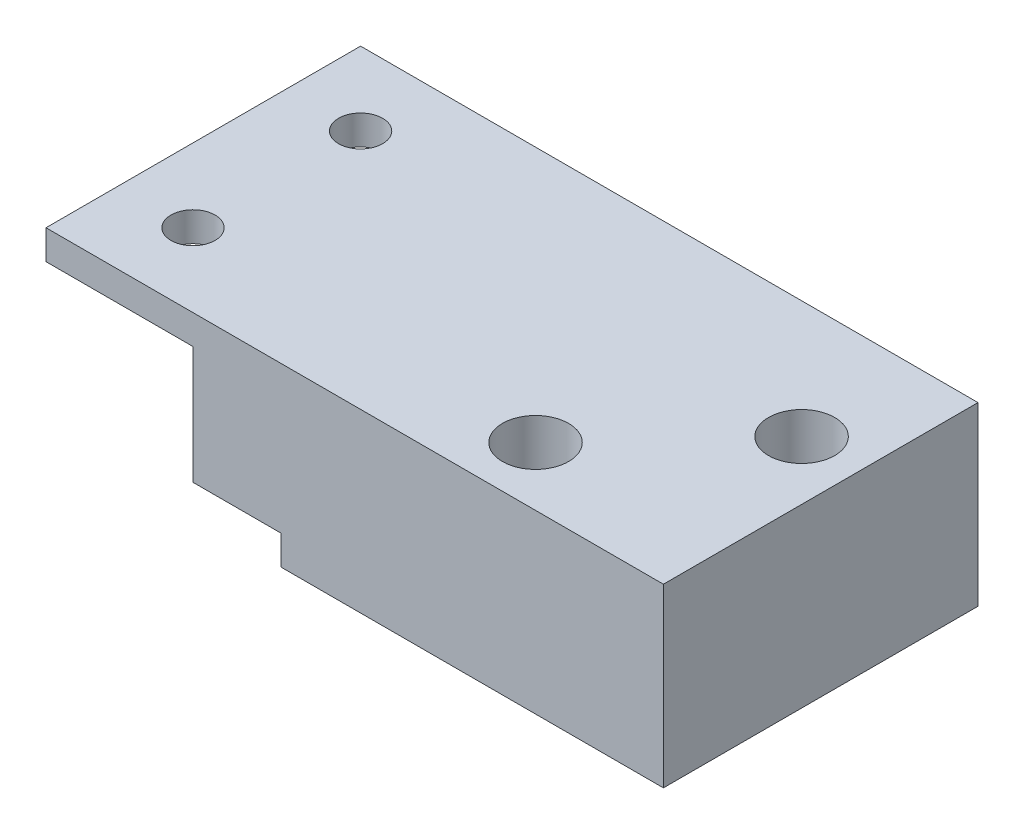
ISO-10303-21;
HEADER;
FILE_DESCRIPTION(('STEP AP214'),'2;1');
FILE_NAME('part.step','',(''),(''),'','','');
FILE_SCHEMA(('AUTOMOTIVE_DESIGN { 1 0 10303 214 1 1 1 1 }'));
ENDSEC;
DATA;
#1=APPLICATION_CONTEXT('core data for automotive mechanical design processes');
#2=APPLICATION_PROTOCOL_DEFINITION('international standard','automotive_design',2000,#1);
#3=PRODUCT_CONTEXT('',#1,'mechanical');
#4=PRODUCT('Part','Part','',(#3));
#5=PRODUCT_RELATED_PRODUCT_CATEGORY('part','',(#4));
#6=PRODUCT_DEFINITION_FORMATION('','',#4);
#7=PRODUCT_DEFINITION_CONTEXT('part definition',#1,'design');
#8=PRODUCT_DEFINITION('design','',#6,#7);
#9=PRODUCT_DEFINITION_SHAPE('','',#8);
#10=(LENGTH_UNIT() NAMED_UNIT(*) SI_UNIT(.MILLI.,.METRE.));
#11=(NAMED_UNIT(*) PLANE_ANGLE_UNIT() SI_UNIT($,.RADIAN.));
#12=(NAMED_UNIT(*) SI_UNIT($,.STERADIAN.) SOLID_ANGLE_UNIT());
#13=UNCERTAINTY_MEASURE_WITH_UNIT(LENGTH_MEASURE(1.E-05),#10,'distance_accuracy_value','');
#14=(GEOMETRIC_REPRESENTATION_CONTEXT(3) GLOBAL_UNCERTAINTY_ASSIGNED_CONTEXT((#13)) GLOBAL_UNIT_ASSIGNED_CONTEXT((#10,
#11,#12)) REPRESENTATION_CONTEXT('',''));
#15=CARTESIAN_POINT('',(0.,0.,0.));
#16=DIRECTION('',(0.,0.,1.));
#17=DIRECTION('',(1.,0.,0.));
#18=AXIS2_PLACEMENT_3D('',#15,#16,#17);
#19=CARTESIAN_POINT('',(0.,12.,21.4));
#20=DIRECTION('',(0.,0.,-1.));
#21=DIRECTION('',(-1.,0.,0.));
#22=AXIS2_PLACEMENT_3D('',#19,#20,#21);
#23=PLANE('',#22);
#24=DIRECTION('',(0.,1.,0.));
#25=VECTOR('',#24,1.);
#26=CARTESIAN_POINT('',(16.,0.,21.4));
#27=LINE('',#26,#25);
#28=CARTESIAN_POINT('',(16.,0.,21.4));
#29=VERTEX_POINT('',#28);
#30=CARTESIAN_POINT('',(16.,2.,21.4));
#31=VERTEX_POINT('',#30);
#32=EDGE_CURVE('E118',#29,#31,#27,.T.);
#33=ORIENTED_EDGE('',*,*,#32,.F.);
#34=DIRECTION('',(1.,0.,0.));
#35=VECTOR('',#34,1.);
#36=CARTESIAN_POINT('',(0.,0.,21.4));
#37=LINE('',#36,#35);
#38=CARTESIAN_POINT('',(42.,0.,21.4));
#39=VERTEX_POINT('',#38);
#40=EDGE_CURVE('E121',#29,#39,#37,.T.);
#41=ORIENTED_EDGE('',*,*,#40,.T.);
#42=DIRECTION('',(0.,-1.,0.));
#43=VECTOR('',#42,1.);
#44=CARTESIAN_POINT('',(42.,12.,21.4));
#45=LINE('',#44,#43);
#46=CARTESIAN_POINT('',(42.,12.,21.4));
#47=VERTEX_POINT('',#46);
#48=EDGE_CURVE('E12',#47,#39,#45,.T.);
#49=ORIENTED_EDGE('',*,*,#48,.F.);
#50=DIRECTION('',(1.,0.,0.));
#51=VECTOR('',#50,1.);
#52=CARTESIAN_POINT('',(0.,12.,21.4));
#53=LINE('',#52,#51);
#54=CARTESIAN_POINT('',(0.,12.,21.4));
#55=VERTEX_POINT('',#54);
#56=EDGE_CURVE('E142',#55,#47,#53,.T.);
#57=ORIENTED_EDGE('',*,*,#56,.F.);
#58=DIRECTION('',(0.,-1.,0.));
#59=VECTOR('',#58,1.);
#60=CARTESIAN_POINT('',(0.,12.,21.4));
#61=LINE('',#60,#59);
#62=CARTESIAN_POINT('',(0.,10.,21.4));
#63=VERTEX_POINT('',#62);
#64=EDGE_CURVE('E66',#55,#63,#61,.T.);
#65=ORIENTED_EDGE('',*,*,#64,.T.);
#66=DIRECTION('',(1.,0.,0.));
#67=VECTOR('',#66,1.);
#68=CARTESIAN_POINT('',(0.,10.,21.4));
#69=LINE('',#68,#67);
#70=CARTESIAN_POINT('',(10.,10.,21.4));
#71=VERTEX_POINT('',#70);
#72=EDGE_CURVE('E191',#63,#71,#69,.T.);
#73=ORIENTED_EDGE('',*,*,#72,.T.);
#74=DIRECTION('',(0.,1.,0.));
#75=VECTOR('',#74,1.);
#76=CARTESIAN_POINT('',(10.,0.,21.4));
#77=LINE('',#76,#75);
#78=CARTESIAN_POINT('',(10.,2.,21.4));
#79=VERTEX_POINT('',#78);
#80=EDGE_CURVE('E189',#79,#71,#77,.T.);
#81=ORIENTED_EDGE('',*,*,#80,.F.);
#82=DIRECTION('',(1.,0.,0.));
#83=VECTOR('',#82,1.);
#84=CARTESIAN_POINT('',(10.,2.,21.4));
#85=LINE('',#84,#83);
#86=EDGE_CURVE('E129',#79,#31,#85,.T.);
#87=ORIENTED_EDGE('',*,*,#86,.T.);
#88=EDGE_LOOP('',(#33,#41,#49,#57,#65,#73,#81,#87));
#89=FACE_BOUND('',#88,.T.);
#90=ADVANCED_FACE('F41',(#89),#23,.F.);
#91=CARTESIAN_POINT('',(0.,12.,0.));
#92=DIRECTION('',(0.,0.,-1.));
#93=DIRECTION('',(-1.,0.,0.));
#94=AXIS2_PLACEMENT_3D('',#91,#92,#93);
#95=PLANE('',#94);
#96=DIRECTION('',(1.,0.,0.));
#97=VECTOR('',#96,1.);
#98=CARTESIAN_POINT('',(0.,0.,0.));
#99=LINE('',#98,#97);
#100=CARTESIAN_POINT('',(16.,0.,0.));
#101=VERTEX_POINT('',#100);
#102=CARTESIAN_POINT('',(42.,0.,0.));
#103=VERTEX_POINT('',#102);
#104=EDGE_CURVE('E82',#101,#103,#99,.T.);
#105=ORIENTED_EDGE('',*,*,#104,.F.);
#106=DIRECTION('',(0.,1.,0.));
#107=VECTOR('',#106,1.);
#108=CARTESIAN_POINT('',(16.,0.,0.));
#109=LINE('',#108,#107);
#110=CARTESIAN_POINT('',(16.,2.,0.));
#111=VERTEX_POINT('',#110);
#112=EDGE_CURVE('E57',#101,#111,#109,.T.);
#113=ORIENTED_EDGE('',*,*,#112,.T.);
#114=DIRECTION('',(1.,0.,0.));
#115=VECTOR('',#114,1.);
#116=CARTESIAN_POINT('',(10.,2.,0.));
#117=LINE('',#116,#115);
#118=CARTESIAN_POINT('',(10.,2.,0.));
#119=VERTEX_POINT('',#118);
#120=EDGE_CURVE('E130',#119,#111,#117,.T.);
#121=ORIENTED_EDGE('',*,*,#120,.F.);
#122=DIRECTION('',(0.,1.,0.));
#123=VECTOR('',#122,1.);
#124=CARTESIAN_POINT('',(10.,0.,0.));
#125=LINE('',#124,#123);
#126=CARTESIAN_POINT('',(10.,10.,0.));
#127=VERTEX_POINT('',#126);
#128=EDGE_CURVE('E177',#119,#127,#125,.T.);
#129=ORIENTED_EDGE('',*,*,#128,.T.);
#130=DIRECTION('',(1.,0.,0.));
#131=VECTOR('',#130,1.);
#132=CARTESIAN_POINT('',(0.,10.,0.));
#133=LINE('',#132,#131);
#134=CARTESIAN_POINT('',(0.,10.,0.));
#135=VERTEX_POINT('',#134);
#136=EDGE_CURVE('E192',#135,#127,#133,.T.);
#137=ORIENTED_EDGE('',*,*,#136,.F.);
#138=DIRECTION('',(0.,-1.,0.));
#139=VECTOR('',#138,1.);
#140=CARTESIAN_POINT('',(0.,12.,0.));
#141=LINE('',#140,#139);
#142=CARTESIAN_POINT('',(0.,12.,0.));
#143=VERTEX_POINT('',#142);
#144=EDGE_CURVE('E144',#143,#135,#141,.T.);
#145=ORIENTED_EDGE('',*,*,#144,.F.);
#146=DIRECTION('',(1.,0.,0.));
#147=VECTOR('',#146,1.);
#148=CARTESIAN_POINT('',(0.,12.,0.));
#149=LINE('',#148,#147);
#150=CARTESIAN_POINT('',(42.,12.,0.));
#151=VERTEX_POINT('',#150);
#152=EDGE_CURVE('E203',#143,#151,#149,.T.);
#153=ORIENTED_EDGE('',*,*,#152,.T.);
#154=DIRECTION('',(0.,-1.,0.));
#155=VECTOR('',#154,1.);
#156=CARTESIAN_POINT('',(42.,12.,0.));
#157=LINE('',#156,#155);
#158=EDGE_CURVE('E49',#151,#103,#157,.T.);
#159=ORIENTED_EDGE('',*,*,#158,.T.);
#160=EDGE_LOOP('',(#105,#113,#121,#129,#137,#145,#153,#159));
#161=FACE_BOUND('',#160,.T.);
#162=ADVANCED_FACE('F212',(#161),#95,.T.);
#163=CARTESIAN_POINT('',(0.,0.,0.));
#164=DIRECTION('',(0.,1.,0.));
#165=DIRECTION('',(0.,0.,1.));
#166=AXIS2_PLACEMENT_3D('',#163,#164,#165);
#167=PLANE('',#166);
#168=CARTESIAN_POINT('',(38.,0.,8.00000000000001));
#169=DIRECTION('',(0.,1.,0.));
#170=DIRECTION('',(0.,0.,1.));
#171=AXIS2_PLACEMENT_3D('',#168,#169,#170);
#172=CIRCLE('',#171,1.5);
#173=CARTESIAN_POINT('',(38.,0.,9.50000000000002));
#174=VERTEX_POINT('',#173);
#175=EDGE_CURVE('E420',#174,#174,#172,.T.);
#176=ORIENTED_EDGE('',*,*,#175,.T.);
#177=EDGE_LOOP('',(#176));
#178=FACE_BOUND('',#177,.T.);
#179=CARTESIAN_POINT('',(29.3,0.,17.4));
#180=DIRECTION('',(0.,1.,0.));
#181=DIRECTION('',(0.,0.,1.));
#182=AXIS2_PLACEMENT_3D('',#179,#180,#181);
#183=CIRCLE('',#182,1.5);
#184=CARTESIAN_POINT('',(29.3,0.,18.9));
#185=VERTEX_POINT('',#184);
#186=EDGE_CURVE('E416',#185,#185,#183,.T.);
#187=ORIENTED_EDGE('',*,*,#186,.T.);
#188=EDGE_LOOP('',(#187));
#189=FACE_BOUND('',#188,.T.);
#190=CARTESIAN_POINT('',(20.3,0.,14.));
#191=DIRECTION('',(0.,-1.,0.));
#192=DIRECTION('',(0.,0.,-1.));
#193=AXIS2_PLACEMENT_3D('',#190,#191,#192);
#194=CIRCLE('',#193,3.1);
#195=CARTESIAN_POINT('',(20.3,0.,10.9));
#196=VERTEX_POINT('',#195);
#197=EDGE_CURVE('E178',#196,#196,#194,.T.);
#198=ORIENTED_EDGE('',*,*,#197,.F.);
#199=EDGE_LOOP('',(#198));
#200=FACE_BOUND('',#199,.T.);
#201=DIRECTION('',(0.,0.,-1.));
#202=VECTOR('',#201,1.);
#203=CARTESIAN_POINT('',(16.,0.,21.4));
#204=LINE('',#203,#202);
#205=EDGE_CURVE('E115',#29,#101,#204,.T.);
#206=ORIENTED_EDGE('',*,*,#205,.T.);
#207=ORIENTED_EDGE('',*,*,#104,.T.);
#208=DIRECTION('',(0.,0.,-1.));
#209=VECTOR('',#208,1.);
#210=CARTESIAN_POINT('',(42.,0.,0.));
#211=LINE('',#210,#209);
#212=EDGE_CURVE('E134',#39,#103,#211,.T.);
#213=ORIENTED_EDGE('',*,*,#212,.F.);
#214=ORIENTED_EDGE('',*,*,#40,.F.);
#215=EDGE_LOOP('',(#206,#207,#213,#214));
#216=FACE_BOUND('',#215,.T.);
#217=ADVANCED_FACE('F132',(#178,#189,#200,#216),#167,.F.);
#218=CARTESIAN_POINT('',(42.,12.,0.));
#219=DIRECTION('',(-1.,0.,0.));
#220=DIRECTION('',(0.,0.,1.));
#221=AXIS2_PLACEMENT_3D('',#218,#219,#220);
#222=PLANE('',#221);
#223=ORIENTED_EDGE('',*,*,#212,.T.);
#224=ORIENTED_EDGE('',*,*,#158,.F.);
#225=DIRECTION('',(0.,0.,-1.));
#226=VECTOR('',#225,1.);
#227=CARTESIAN_POINT('',(42.,12.,0.));
#228=LINE('',#227,#226);
#229=EDGE_CURVE('E89',#47,#151,#228,.T.);
#230=ORIENTED_EDGE('',*,*,#229,.F.);
#231=ORIENTED_EDGE('',*,*,#48,.T.);
#232=EDGE_LOOP('',(#223,#224,#230,#231));
#233=FACE_BOUND('',#232,.T.);
#234=ADVANCED_FACE('F211',(#233),#222,.F.);
#235=CARTESIAN_POINT('',(0.,12.,0.));
#236=DIRECTION('',(-1.,0.,0.));
#237=DIRECTION('',(0.,0.,1.));
#238=AXIS2_PLACEMENT_3D('',#235,#236,#237);
#239=PLANE('',#238);
#240=DIRECTION('',(0.,0.,-1.));
#241=VECTOR('',#240,1.);
#242=CARTESIAN_POINT('',(0.,10.,21.4));
#243=LINE('',#242,#241);
#244=EDGE_CURVE('E195',#63,#135,#243,.T.);
#245=ORIENTED_EDGE('',*,*,#244,.F.);
#246=ORIENTED_EDGE('',*,*,#64,.F.);
#247=DIRECTION('',(0.,0.,-1.));
#248=VECTOR('',#247,1.);
#249=CARTESIAN_POINT('',(0.,12.,0.));
#250=LINE('',#249,#248);
#251=EDGE_CURVE('E138',#55,#143,#250,.T.);
#252=ORIENTED_EDGE('',*,*,#251,.T.);
#253=ORIENTED_EDGE('',*,*,#144,.T.);
#254=EDGE_LOOP('',(#245,#246,#252,#253));
#255=FACE_BOUND('',#254,.T.);
#256=ADVANCED_FACE('F208',(#255),#239,.T.);
#257=CARTESIAN_POINT('',(0.,12.,0.));
#258=DIRECTION('',(0.,1.,0.));
#259=DIRECTION('',(0.,0.,1.));
#260=AXIS2_PLACEMENT_3D('',#257,#258,#259);
#261=PLANE('',#260);
#262=CARTESIAN_POINT('',(4.99999999999999,12.,16.4));
#263=DIRECTION('',(0.,1.,0.));
#264=DIRECTION('',(0.,0.,1.));
#265=AXIS2_PLACEMENT_3D('',#262,#263,#264);
#266=CIRCLE('',#265,1.5);
#267=CARTESIAN_POINT('',(4.99999999999999,12.,17.9));
#268=VERTEX_POINT('',#267);
#269=EDGE_CURVE('E261',#268,#268,#266,.T.);
#270=ORIENTED_EDGE('',*,*,#269,.F.);
#271=EDGE_LOOP('',(#270));
#272=FACE_BOUND('',#271,.T.);
#273=CARTESIAN_POINT('',(4.99999999999999,12.,5.00000000000003));
#274=DIRECTION('',(0.,1.,0.));
#275=DIRECTION('',(0.,0.,1.));
#276=AXIS2_PLACEMENT_3D('',#273,#274,#275);
#277=CIRCLE('',#276,1.5);
#278=CARTESIAN_POINT('',(4.99999999999999,12.,6.50000000000003));
#279=VERTEX_POINT('',#278);
#280=EDGE_CURVE('E152',#279,#279,#277,.T.);
#281=ORIENTED_EDGE('',*,*,#280,.F.);
#282=EDGE_LOOP('',(#281));
#283=FACE_BOUND('',#282,.T.);
#284=CARTESIAN_POINT('',(38.,12.,8.00000000000001));
#285=DIRECTION('',(0.,1.,0.));
#286=DIRECTION('',(0.,0.,1.));
#287=AXIS2_PLACEMENT_3D('',#284,#285,#286);
#288=CIRCLE('',#287,2.25);
#289=CARTESIAN_POINT('',(38.,12.,10.25));
#290=VERTEX_POINT('',#289);
#291=EDGE_CURVE('E168',#290,#290,#288,.T.);
#292=ORIENTED_EDGE('',*,*,#291,.F.);
#293=EDGE_LOOP('',(#292));
#294=FACE_BOUND('',#293,.T.);
#295=CARTESIAN_POINT('',(29.3,12.,17.4));
#296=DIRECTION('',(0.,1.,0.));
#297=DIRECTION('',(0.,0.,1.));
#298=AXIS2_PLACEMENT_3D('',#295,#296,#297);
#299=CIRCLE('',#298,2.25000000000001);
#300=CARTESIAN_POINT('',(29.3,12.,19.65));
#301=VERTEX_POINT('',#300);
#302=EDGE_CURVE('E163',#301,#301,#299,.T.);
#303=ORIENTED_EDGE('',*,*,#302,.F.);
#304=EDGE_LOOP('',(#303));
#305=FACE_BOUND('',#304,.T.);
#306=ORIENTED_EDGE('',*,*,#56,.T.);
#307=ORIENTED_EDGE('',*,*,#229,.T.);
#308=ORIENTED_EDGE('',*,*,#152,.F.);
#309=ORIENTED_EDGE('',*,*,#251,.F.);
#310=EDGE_LOOP('',(#306,#307,#308,#309));
#311=FACE_BOUND('',#310,.T.);
#312=ADVANCED_FACE('F210',(#272,#283,#294,#305,#311),#261,.T.);
#313=CARTESIAN_POINT('',(16.,0.,21.4));
#314=DIRECTION('',(-1.,0.,0.));
#315=DIRECTION('',(0.,0.,1.));
#316=AXIS2_PLACEMENT_3D('',#313,#314,#315);
#317=PLANE('',#316);
#318=ORIENTED_EDGE('',*,*,#112,.F.);
#319=ORIENTED_EDGE('',*,*,#205,.F.);
#320=ORIENTED_EDGE('',*,*,#32,.T.);
#321=DIRECTION('',(0.,0.,-1.));
#322=VECTOR('',#321,1.);
#323=CARTESIAN_POINT('',(16.,2.,21.4));
#324=LINE('',#323,#322);
#325=EDGE_CURVE('E122',#31,#111,#324,.T.);
#326=ORIENTED_EDGE('',*,*,#325,.T.);
#327=EDGE_LOOP('',(#318,#319,#320,#326));
#328=FACE_BOUND('',#327,.T.);
#329=ADVANCED_FACE('F117',(#328),#317,.T.);
#330=CARTESIAN_POINT('',(10.,2.,21.4));
#331=DIRECTION('',(0.,1.,0.));
#332=DIRECTION('',(-1.,0.,0.));
#333=AXIS2_PLACEMENT_3D('',#330,#331,#332);
#334=PLANE('',#333);
#335=ORIENTED_EDGE('',*,*,#120,.T.);
#336=ORIENTED_EDGE('',*,*,#325,.F.);
#337=ORIENTED_EDGE('',*,*,#86,.F.);
#338=DIRECTION('',(0.,0.,-1.));
#339=VECTOR('',#338,1.);
#340=CARTESIAN_POINT('',(10.,2.,21.4));
#341=LINE('',#340,#339);
#342=EDGE_CURVE('E182',#79,#119,#341,.T.);
#343=ORIENTED_EDGE('',*,*,#342,.T.);
#344=EDGE_LOOP('',(#335,#336,#337,#343));
#345=FACE_BOUND('',#344,.T.);
#346=ADVANCED_FACE('F217',(#345),#334,.F.);
#347=CARTESIAN_POINT('',(0.,10.,21.4));
#348=DIRECTION('',(0.,1.,0.));
#349=DIRECTION('',(-1.,0.,0.));
#350=AXIS2_PLACEMENT_3D('',#347,#348,#349);
#351=PLANE('',#350);
#352=CARTESIAN_POINT('',(4.99999999999999,10.,16.4));
#353=DIRECTION('',(0.,1.,0.));
#354=DIRECTION('',(-1.,0.,0.));
#355=AXIS2_PLACEMENT_3D('',#352,#353,#354);
#356=CIRCLE('',#355,1.5);
#357=CARTESIAN_POINT('',(4.99999999999999,10.,17.9));
#358=VERTEX_POINT('',#357);
#359=EDGE_CURVE('E44',#358,#358,#356,.T.);
#360=ORIENTED_EDGE('',*,*,#359,.T.);
#361=EDGE_LOOP('',(#360));
#362=FACE_BOUND('',#361,.T.);
#363=CARTESIAN_POINT('',(4.99999999999999,10.,5.00000000000003));
#364=DIRECTION('',(0.,1.,0.));
#365=DIRECTION('',(-1.,0.,0.));
#366=AXIS2_PLACEMENT_3D('',#363,#364,#365);
#367=CIRCLE('',#366,1.5);
#368=CARTESIAN_POINT('',(4.99999999999999,10.,6.50000000000003));
#369=VERTEX_POINT('',#368);
#370=EDGE_CURVE('E154',#369,#369,#367,.T.);
#371=ORIENTED_EDGE('',*,*,#370,.T.);
#372=EDGE_LOOP('',(#371));
#373=FACE_BOUND('',#372,.T.);
#374=ORIENTED_EDGE('',*,*,#136,.T.);
#375=DIRECTION('',(0.,0.,-1.));
#376=VECTOR('',#375,1.);
#377=CARTESIAN_POINT('',(10.,10.,21.4));
#378=LINE('',#377,#376);
#379=EDGE_CURVE('E184',#71,#127,#378,.T.);
#380=ORIENTED_EDGE('',*,*,#379,.F.);
#381=ORIENTED_EDGE('',*,*,#72,.F.);
#382=ORIENTED_EDGE('',*,*,#244,.T.);
#383=EDGE_LOOP('',(#374,#380,#381,#382));
#384=FACE_BOUND('',#383,.T.);
#385=ADVANCED_FACE('F222',(#362,#373,#384),#351,.F.);
#386=CARTESIAN_POINT('',(10.,0.,21.4));
#387=DIRECTION('',(-1.,0.,0.));
#388=DIRECTION('',(0.,0.,1.));
#389=AXIS2_PLACEMENT_3D('',#386,#387,#388);
#390=PLANE('',#389);
#391=ORIENTED_EDGE('',*,*,#80,.T.);
#392=ORIENTED_EDGE('',*,*,#379,.T.);
#393=ORIENTED_EDGE('',*,*,#128,.F.);
#394=ORIENTED_EDGE('',*,*,#342,.F.);
#395=EDGE_LOOP('',(#391,#392,#393,#394));
#396=FACE_BOUND('',#395,.T.);
#397=ADVANCED_FACE('F219',(#396),#390,.T.);
#398=CARTESIAN_POINT('',(20.3,2.6,14.));
#399=DIRECTION('',(0.,-1.,0.));
#400=DIRECTION('',(0.,0.,-1.));
#401=AXIS2_PLACEMENT_3D('',#398,#399,#400);
#402=CYLINDRICAL_SURFACE('',#401,3.1);
#403=CARTESIAN_POINT('',(20.3,2.6,14.));
#404=DIRECTION('',(0.,-1.,0.));
#405=DIRECTION('',(0.,0.,-1.));
#406=AXIS2_PLACEMENT_3D('',#403,#404,#405);
#407=CIRCLE('',#406,3.1);
#408=CARTESIAN_POINT('',(20.3,2.6,10.9));
#409=VERTEX_POINT('',#408);
#410=EDGE_CURVE('E174',#409,#409,#407,.T.);
#411=ORIENTED_EDGE('',*,*,#410,.F.);
#412=EDGE_LOOP('',(#411));
#413=FACE_BOUND('',#412,.T.);
#414=ORIENTED_EDGE('',*,*,#197,.T.);
#415=EDGE_LOOP('',(#414));
#416=FACE_BOUND('',#415,.T.);
#417=ADVANCED_FACE('F230',(#413,#416),#402,.F.);
#418=CARTESIAN_POINT('',(20.3,2.6,14.));
#419=DIRECTION('',(0.,-1.,0.));
#420=DIRECTION('',(0.,0.,-1.));
#421=AXIS2_PLACEMENT_3D('',#418,#419,#420);
#422=PLANE('',#421);
#423=ORIENTED_EDGE('',*,*,#410,.T.);
#424=EDGE_LOOP('',(#423));
#425=FACE_BOUND('',#424,.T.);
#426=ADVANCED_FACE('F273',(#425),#422,.T.);
#427=CARTESIAN_POINT('',(29.3,-6.36396103067894,17.4));
#428=DIRECTION('',(0.,1.,0.));
#429=DIRECTION('',(0.,0.,1.));
#430=AXIS2_PLACEMENT_3D('',#427,#428,#429);
#431=CYLINDRICAL_SURFACE('',#430,2.25000000000001);
#432=CARTESIAN_POINT('',(29.3,2.,17.4));
#433=DIRECTION('',(0.,1.,0.));
#434=DIRECTION('',(0.,0.,1.));
#435=AXIS2_PLACEMENT_3D('',#432,#433,#434);
#436=CIRCLE('',#435,2.25000000000001);
#437=CARTESIAN_POINT('',(29.3,2.,19.65));
#438=VERTEX_POINT('',#437);
#439=EDGE_CURVE('E159',#438,#438,#436,.F.);
#440=ORIENTED_EDGE('',*,*,#439,.T.);
#441=EDGE_LOOP('',(#440));
#442=FACE_BOUND('',#441,.T.);
#443=ORIENTED_EDGE('',*,*,#302,.T.);
#444=EDGE_LOOP('',(#443));
#445=FACE_BOUND('',#444,.T.);
#446=ADVANCED_FACE('F270',(#442,#445),#431,.F.);
#447=CARTESIAN_POINT('',(0.,2.,0.));
#448=DIRECTION('',(0.,1.,0.));
#449=DIRECTION('',(0.,0.,1.));
#450=AXIS2_PLACEMENT_3D('',#447,#448,#449);
#451=PLANE('',#450);
#452=CARTESIAN_POINT('',(29.3,2.,17.4));
#453=DIRECTION('',(0.,1.,0.));
#454=DIRECTION('',(0.,0.,1.));
#455=AXIS2_PLACEMENT_3D('',#452,#453,#454);
#456=CIRCLE('',#455,1.5);
#457=CARTESIAN_POINT('',(29.3,2.,18.9));
#458=VERTEX_POINT('',#457);
#459=EDGE_CURVE('E151',#458,#458,#456,.T.);
#460=ORIENTED_EDGE('',*,*,#459,.F.);
#461=EDGE_LOOP('',(#460));
#462=FACE_BOUND('',#461,.T.);
#463=ORIENTED_EDGE('',*,*,#439,.F.);
#464=EDGE_LOOP('',(#463));
#465=FACE_BOUND('',#464,.T.);
#466=ADVANCED_FACE('F272',(#462,#465),#451,.T.);
#467=CARTESIAN_POINT('',(38.,-6.36396103067894,8.00000000000001));
#468=DIRECTION('',(0.,1.,0.));
#469=DIRECTION('',(0.,0.,1.));
#470=AXIS2_PLACEMENT_3D('',#467,#468,#469);
#471=CYLINDRICAL_SURFACE('',#470,2.25);
#472=CARTESIAN_POINT('',(38.,2.,8.00000000000001));
#473=DIRECTION('',(0.,1.,0.));
#474=DIRECTION('',(0.,0.,1.));
#475=AXIS2_PLACEMENT_3D('',#472,#473,#474);
#476=CIRCLE('',#475,2.25);
#477=CARTESIAN_POINT('',(38.,2.,10.25));
#478=VERTEX_POINT('',#477);
#479=EDGE_CURVE('E171',#478,#478,#476,.F.);
#480=ORIENTED_EDGE('',*,*,#479,.T.);
#481=EDGE_LOOP('',(#480));
#482=FACE_BOUND('',#481,.T.);
#483=ORIENTED_EDGE('',*,*,#291,.T.);
#484=EDGE_LOOP('',(#483));
#485=FACE_BOUND('',#484,.T.);
#486=ADVANCED_FACE('F279',(#482,#485),#471,.F.);
#487=CARTESIAN_POINT('',(0.,2.,0.));
#488=DIRECTION('',(0.,1.,0.));
#489=DIRECTION('',(0.,0.,1.));
#490=AXIS2_PLACEMENT_3D('',#487,#488,#489);
#491=PLANE('',#490);
#492=CARTESIAN_POINT('',(38.,2.,8.00000000000001));
#493=DIRECTION('',(0.,1.,0.));
#494=DIRECTION('',(0.,0.,1.));
#495=AXIS2_PLACEMENT_3D('',#492,#493,#494);
#496=CIRCLE('',#495,1.5);
#497=CARTESIAN_POINT('',(38.,2.,9.50000000000002));
#498=VERTEX_POINT('',#497);
#499=EDGE_CURVE('E148',#498,#498,#496,.T.);
#500=ORIENTED_EDGE('',*,*,#499,.F.);
#501=EDGE_LOOP('',(#500));
#502=FACE_BOUND('',#501,.T.);
#503=ORIENTED_EDGE('',*,*,#479,.F.);
#504=EDGE_LOOP('',(#503));
#505=FACE_BOUND('',#504,.T.);
#506=ADVANCED_FACE('F314',(#502,#505),#491,.T.);
#507=CARTESIAN_POINT('',(38.,0.,8.00000000000001));
#508=DIRECTION('',(0.,1.,0.));
#509=DIRECTION('',(0.,0.,1.));
#510=AXIS2_PLACEMENT_3D('',#507,#508,#509);
#511=CYLINDRICAL_SURFACE('',#510,1.5);
#512=CARTESIAN_POINT('',(38.,2.,9.50000000000002));
#513=CARTESIAN_POINT('',(38.,1.97916666666667,9.50000000000002));
#514=CARTESIAN_POINT('',(38.,1.95833333333333,9.50000000000002));
#515=CARTESIAN_POINT('',(38.,1.91666666666667,9.50000000000002));
#516=CARTESIAN_POINT('',(38.,1.89583333333333,9.50000000000002));
#517=CARTESIAN_POINT('',(38.,1.85416666666667,9.50000000000002));
#518=CARTESIAN_POINT('',(38.,1.83333333333333,9.50000000000002));
#519=CARTESIAN_POINT('',(38.,1.79166666666667,9.50000000000002));
#520=CARTESIAN_POINT('',(38.,1.77083333333333,9.50000000000002));
#521=CARTESIAN_POINT('',(38.,1.72916666666667,9.50000000000002));
#522=CARTESIAN_POINT('',(38.,1.70833333333333,9.50000000000002));
#523=CARTESIAN_POINT('',(38.,1.66666666666667,9.50000000000002));
#524=CARTESIAN_POINT('',(38.,1.64583333333333,9.50000000000002));
#525=CARTESIAN_POINT('',(38.,1.60416666666667,9.50000000000002));
#526=CARTESIAN_POINT('',(38.,1.58333333333333,9.50000000000002));
#527=CARTESIAN_POINT('',(38.,1.54166666666667,9.50000000000002));
#528=CARTESIAN_POINT('',(38.,1.52083333333333,9.50000000000002));
#529=CARTESIAN_POINT('',(38.,1.47916666666667,9.50000000000002));
#530=CARTESIAN_POINT('',(38.,1.45833333333333,9.50000000000002));
#531=CARTESIAN_POINT('',(38.,1.41666666666667,9.50000000000002));
#532=CARTESIAN_POINT('',(38.,1.39583333333333,9.50000000000002));
#533=CARTESIAN_POINT('',(38.,1.35416666666667,9.50000000000002));
#534=CARTESIAN_POINT('',(38.,1.33333333333333,9.50000000000002));
#535=CARTESIAN_POINT('',(38.,1.29166666666667,9.50000000000002));
#536=CARTESIAN_POINT('',(38.,1.27083333333333,9.50000000000002));
#537=CARTESIAN_POINT('',(38.,1.22916666666667,9.50000000000002));
#538=CARTESIAN_POINT('',(38.,1.20833333333333,9.50000000000002));
#539=CARTESIAN_POINT('',(38.,1.16666666666667,9.50000000000002));
#540=CARTESIAN_POINT('',(38.,1.14583333333333,9.50000000000002));
#541=CARTESIAN_POINT('',(38.,1.10416666666667,9.50000000000002));
#542=CARTESIAN_POINT('',(38.,1.08333333333333,9.50000000000002));
#543=CARTESIAN_POINT('',(38.,1.04166666666667,9.50000000000002));
#544=CARTESIAN_POINT('',(38.,1.02083333333333,9.50000000000002));
#545=CARTESIAN_POINT('',(38.,0.979166666666666,9.50000000000002));
#546=CARTESIAN_POINT('',(38.,0.958333333333332,9.50000000000002));
#547=CARTESIAN_POINT('',(38.,0.916666666666666,9.50000000000002));
#548=CARTESIAN_POINT('',(38.,0.895833333333332,9.50000000000002));
#549=CARTESIAN_POINT('',(38.,0.854166666666666,9.50000000000002));
#550=CARTESIAN_POINT('',(38.,0.833333333333332,9.50000000000002));
#551=CARTESIAN_POINT('',(38.,0.791666666666666,9.50000000000002));
#552=CARTESIAN_POINT('',(38.,0.770833333333332,9.50000000000002));
#553=CARTESIAN_POINT('',(38.,0.729166666666666,9.50000000000002));
#554=CARTESIAN_POINT('',(38.,0.708333333333332,9.50000000000002));
#555=CARTESIAN_POINT('',(38.,0.666666666666665,9.50000000000002));
#556=CARTESIAN_POINT('',(38.,0.645833333333332,9.50000000000002));
#557=CARTESIAN_POINT('',(38.,0.604166666666665,9.50000000000002));
#558=CARTESIAN_POINT('',(38.,0.583333333333332,9.50000000000002));
#559=CARTESIAN_POINT('',(38.,0.541666666666665,9.50000000000002));
#560=CARTESIAN_POINT('',(38.,0.520833333333332,9.50000000000002));
#561=CARTESIAN_POINT('',(38.,0.479166666666665,9.50000000000002));
#562=CARTESIAN_POINT('',(38.,0.458333333333332,9.50000000000002));
#563=CARTESIAN_POINT('',(38.,0.416666666666665,9.50000000000002));
#564=CARTESIAN_POINT('',(38.,0.395833333333332,9.50000000000002));
#565=CARTESIAN_POINT('',(38.,0.354166666666665,9.50000000000002));
#566=CARTESIAN_POINT('',(38.,0.333333333333332,9.50000000000002));
#567=CARTESIAN_POINT('',(38.,0.291666666666665,9.50000000000002));
#568=CARTESIAN_POINT('',(38.,0.270833333333332,9.50000000000002));
#569=CARTESIAN_POINT('',(38.,0.229166666666665,9.50000000000002));
#570=CARTESIAN_POINT('',(38.,0.208333333333332,9.50000000000002));
#571=CARTESIAN_POINT('',(38.,0.166666666666665,9.50000000000002));
#572=CARTESIAN_POINT('',(38.,0.145833333333332,9.50000000000002));
#573=CARTESIAN_POINT('',(38.,0.104166666666665,9.50000000000002));
#574=CARTESIAN_POINT('',(38.,0.0833333333333316,9.50000000000002));
#575=CARTESIAN_POINT('',(38.,0.041666666666665,9.50000000000002));
#576=CARTESIAN_POINT('',(38.,0.0208333333333316,9.50000000000002));
#577=CARTESIAN_POINT('',(38.,0.,9.50000000000002));
#578=B_SPLINE_CURVE_WITH_KNOTS('',3,(#512,#513,#514,#515,#516,#517,#518,#519,#520,#521,#522,
#523,#524,#525,#526,#527,#528,#529,#530,#531,#532,#533,#534,#535,#536,#537,#538,#539,#540,#541,
#542,#543,#544,#545,#546,#547,#548,#549,#550,#551,#552,#553,#554,#555,#556,#557,#558,#559,#560,
#561,#562,#563,#564,#565,#566,#567,#568,#569,#570,#571,#572,#573,#574,#575,#576,#577),
.UNSPECIFIED.,.F.,.F.,(4,2,2,2,2,2,2,2,2,2,2,2,2,2,2,2,2,2,2,2,2,2,2,2,2,2,2,2,2,2,2,2,4),(0.,
0.0624999999999998,0.125,0.1875,0.25,0.3125,0.375,0.4375,0.5,0.5625,0.625,0.6875,0.75,
0.812500000000001,0.875000000000001,0.937500000000001,1.,1.0625,1.125,1.1875,1.25,1.3125,1.375,
1.4375,1.5,1.5625,1.625,1.6875,1.75,1.8125,1.875,1.9375,2.),.UNSPECIFIED.);
#579=EDGE_CURVE('BSEAM372',#498,#174,#578,.T.);
#580=ORIENTED_EDGE('',*,*,#499,.T.);
#581=ORIENTED_EDGE('',*,*,#175,.F.);
#582=ORIENTED_EDGE('',*,*,#579,.T.);
#583=ORIENTED_EDGE('',*,*,#579,.F.);
#584=EDGE_LOOP('',(#580,#582,#581,#583));
#585=FACE_BOUND('',#584,.T.);
#586=ADVANCED_FACE('F372',(#585),#511,.F.);
#587=CARTESIAN_POINT('',(29.3,0.,17.4));
#588=DIRECTION('',(0.,1.,0.));
#589=DIRECTION('',(0.,0.,1.));
#590=AXIS2_PLACEMENT_3D('',#587,#588,#589);
#591=CYLINDRICAL_SURFACE('',#590,1.5);
#592=CARTESIAN_POINT('',(29.3,2.,18.9));
#593=CARTESIAN_POINT('',(29.3,1.97916666666667,18.9));
#594=CARTESIAN_POINT('',(29.3,1.95833333333333,18.9));
#595=CARTESIAN_POINT('',(29.3,1.91666666666667,18.9));
#596=CARTESIAN_POINT('',(29.3,1.89583333333333,18.9));
#597=CARTESIAN_POINT('',(29.3,1.85416666666667,18.9));
#598=CARTESIAN_POINT('',(29.3,1.83333333333333,18.9));
#599=CARTESIAN_POINT('',(29.3,1.79166666666667,18.9));
#600=CARTESIAN_POINT('',(29.3,1.77083333333333,18.9));
#601=CARTESIAN_POINT('',(29.3,1.72916666666667,18.9));
#602=CARTESIAN_POINT('',(29.3,1.70833333333333,18.9));
#603=CARTESIAN_POINT('',(29.3,1.66666666666667,18.9));
#604=CARTESIAN_POINT('',(29.3,1.64583333333333,18.9));
#605=CARTESIAN_POINT('',(29.3,1.60416666666667,18.9));
#606=CARTESIAN_POINT('',(29.3,1.58333333333333,18.9));
#607=CARTESIAN_POINT('',(29.3,1.54166666666667,18.9));
#608=CARTESIAN_POINT('',(29.3,1.52083333333333,18.9));
#609=CARTESIAN_POINT('',(29.3,1.47916666666667,18.9));
#610=CARTESIAN_POINT('',(29.3,1.45833333333333,18.9));
#611=CARTESIAN_POINT('',(29.3,1.41666666666667,18.9));
#612=CARTESIAN_POINT('',(29.3,1.39583333333333,18.9));
#613=CARTESIAN_POINT('',(29.3,1.35416666666667,18.9));
#614=CARTESIAN_POINT('',(29.3,1.33333333333333,18.9));
#615=CARTESIAN_POINT('',(29.3,1.29166666666667,18.9));
#616=CARTESIAN_POINT('',(29.3,1.27083333333333,18.9));
#617=CARTESIAN_POINT('',(29.3,1.22916666666667,18.9));
#618=CARTESIAN_POINT('',(29.3,1.20833333333333,18.9));
#619=CARTESIAN_POINT('',(29.3,1.16666666666667,18.9));
#620=CARTESIAN_POINT('',(29.3,1.14583333333333,18.9));
#621=CARTESIAN_POINT('',(29.3,1.10416666666667,18.9));
#622=CARTESIAN_POINT('',(29.3,1.08333333333333,18.9));
#623=CARTESIAN_POINT('',(29.3,1.04166666666667,18.9));
#624=CARTESIAN_POINT('',(29.3,1.02083333333333,18.9));
#625=CARTESIAN_POINT('',(29.3,0.979166666666666,18.9));
#626=CARTESIAN_POINT('',(29.3,0.958333333333332,18.9));
#627=CARTESIAN_POINT('',(29.3,0.916666666666666,18.9));
#628=CARTESIAN_POINT('',(29.3,0.895833333333332,18.9));
#629=CARTESIAN_POINT('',(29.3,0.854166666666666,18.9));
#630=CARTESIAN_POINT('',(29.3,0.833333333333332,18.9));
#631=CARTESIAN_POINT('',(29.3,0.791666666666666,18.9));
#632=CARTESIAN_POINT('',(29.3,0.770833333333332,18.9));
#633=CARTESIAN_POINT('',(29.3,0.729166666666666,18.9));
#634=CARTESIAN_POINT('',(29.3,0.708333333333332,18.9));
#635=CARTESIAN_POINT('',(29.3,0.666666666666665,18.9));
#636=CARTESIAN_POINT('',(29.3,0.645833333333332,18.9));
#637=CARTESIAN_POINT('',(29.3,0.604166666666665,18.9));
#638=CARTESIAN_POINT('',(29.3,0.583333333333332,18.9));
#639=CARTESIAN_POINT('',(29.3,0.541666666666665,18.9));
#640=CARTESIAN_POINT('',(29.3,0.520833333333332,18.9));
#641=CARTESIAN_POINT('',(29.3,0.479166666666665,18.9));
#642=CARTESIAN_POINT('',(29.3,0.458333333333332,18.9));
#643=CARTESIAN_POINT('',(29.3,0.416666666666665,18.9));
#644=CARTESIAN_POINT('',(29.3,0.395833333333332,18.9));
#645=CARTESIAN_POINT('',(29.3,0.354166666666665,18.9));
#646=CARTESIAN_POINT('',(29.3,0.333333333333332,18.9));
#647=CARTESIAN_POINT('',(29.3,0.291666666666665,18.9));
#648=CARTESIAN_POINT('',(29.3,0.270833333333332,18.9));
#649=CARTESIAN_POINT('',(29.3,0.229166666666665,18.9));
#650=CARTESIAN_POINT('',(29.3,0.208333333333332,18.9));
#651=CARTESIAN_POINT('',(29.3,0.166666666666665,18.9));
#652=CARTESIAN_POINT('',(29.3,0.145833333333332,18.9));
#653=CARTESIAN_POINT('',(29.3,0.104166666666665,18.9));
#654=CARTESIAN_POINT('',(29.3,0.0833333333333316,18.9));
#655=CARTESIAN_POINT('',(29.3,0.041666666666665,18.9));
#656=CARTESIAN_POINT('',(29.3,0.0208333333333316,18.9));
#657=CARTESIAN_POINT('',(29.3,0.,18.9));
#658=B_SPLINE_CURVE_WITH_KNOTS('',3,(#592,#593,#594,#595,#596,#597,#598,#599,#600,#601,#602,
#603,#604,#605,#606,#607,#608,#609,#610,#611,#612,#613,#614,#615,#616,#617,#618,#619,#620,#621,
#622,#623,#624,#625,#626,#627,#628,#629,#630,#631,#632,#633,#634,#635,#636,#637,#638,#639,#640,
#641,#642,#643,#644,#645,#646,#647,#648,#649,#650,#651,#652,#653,#654,#655,#656,#657),
.UNSPECIFIED.,.F.,.F.,(4,2,2,2,2,2,2,2,2,2,2,2,2,2,2,2,2,2,2,2,2,2,2,2,2,2,2,2,2,2,2,2,4),(0.,
0.0624999999999998,0.125,0.1875,0.25,0.3125,0.375,0.4375,0.5,0.5625,0.625,0.6875,0.75,
0.812500000000001,0.875000000000001,0.937500000000001,1.,1.0625,1.125,1.1875,1.25,1.3125,1.375,
1.4375,1.5,1.5625,1.625,1.6875,1.75,1.8125,1.875,1.9375,2.),.UNSPECIFIED.);
#659=EDGE_CURVE('BSEAM378',#458,#185,#658,.T.);
#660=ORIENTED_EDGE('',*,*,#459,.T.);
#661=ORIENTED_EDGE('',*,*,#186,.F.);
#662=ORIENTED_EDGE('',*,*,#659,.T.);
#663=ORIENTED_EDGE('',*,*,#659,.F.);
#664=EDGE_LOOP('',(#660,#662,#661,#663));
#665=FACE_BOUND('',#664,.T.);
#666=ADVANCED_FACE('F378',(#665),#591,.F.);
#667=CARTESIAN_POINT('',(4.99999999999999,0.,5.00000000000003));
#668=DIRECTION('',(0.,1.,0.));
#669=DIRECTION('',(0.,0.,1.));
#670=AXIS2_PLACEMENT_3D('',#667,#668,#669);
#671=CYLINDRICAL_SURFACE('',#670,1.5);
#672=CARTESIAN_POINT('',(4.99999999999999,12.,6.50000000000003));
#673=CARTESIAN_POINT('',(4.99999999999999,11.9791666666667,6.50000000000003));
#674=CARTESIAN_POINT('',(4.99999999999999,11.9583333333333,6.50000000000003));
#675=CARTESIAN_POINT('',(4.99999999999999,11.9166666666667,6.50000000000003));
#676=CARTESIAN_POINT('',(4.99999999999999,11.8958333333333,6.50000000000003));
#677=CARTESIAN_POINT('',(4.99999999999999,11.8541666666667,6.50000000000003));
#678=CARTESIAN_POINT('',(4.99999999999999,11.8333333333333,6.50000000000003));
#679=CARTESIAN_POINT('',(4.99999999999999,11.7916666666667,6.50000000000003));
#680=CARTESIAN_POINT('',(4.99999999999999,11.7708333333333,6.50000000000003));
#681=CARTESIAN_POINT('',(4.99999999999999,11.7291666666667,6.50000000000003));
#682=CARTESIAN_POINT('',(4.99999999999999,11.7083333333333,6.50000000000003));
#683=CARTESIAN_POINT('',(4.99999999999999,11.6666666666667,6.50000000000003));
#684=CARTESIAN_POINT('',(4.99999999999999,11.6458333333333,6.50000000000003));
#685=CARTESIAN_POINT('',(4.99999999999999,11.6041666666667,6.50000000000003));
#686=CARTESIAN_POINT('',(4.99999999999999,11.5833333333333,6.50000000000003));
#687=CARTESIAN_POINT('',(4.99999999999999,11.5416666666667,6.50000000000003));
#688=CARTESIAN_POINT('',(4.99999999999999,11.5208333333333,6.50000000000003));
#689=CARTESIAN_POINT('',(4.99999999999999,11.4791666666667,6.50000000000003));
#690=CARTESIAN_POINT('',(4.99999999999999,11.4583333333333,6.50000000000003));
#691=CARTESIAN_POINT('',(4.99999999999999,11.4166666666667,6.50000000000003));
#692=CARTESIAN_POINT('',(4.99999999999999,11.3958333333333,6.50000000000003));
#693=CARTESIAN_POINT('',(4.99999999999999,11.3541666666667,6.50000000000003));
#694=CARTESIAN_POINT('',(4.99999999999999,11.3333333333333,6.50000000000003));
#695=CARTESIAN_POINT('',(4.99999999999999,11.2916666666667,6.50000000000003));
#696=CARTESIAN_POINT('',(4.99999999999999,11.2708333333333,6.50000000000003));
#697=CARTESIAN_POINT('',(4.99999999999999,11.2291666666667,6.50000000000003));
#698=CARTESIAN_POINT('',(4.99999999999999,11.2083333333333,6.50000000000003));
#699=CARTESIAN_POINT('',(4.99999999999999,11.1666666666667,6.50000000000003));
#700=CARTESIAN_POINT('',(4.99999999999999,11.1458333333333,6.50000000000003));
#701=CARTESIAN_POINT('',(4.99999999999999,11.1041666666667,6.50000000000003));
#702=CARTESIAN_POINT('',(4.99999999999999,11.0833333333333,6.50000000000003));
#703=CARTESIAN_POINT('',(4.99999999999999,11.0416666666667,6.50000000000003));
#704=CARTESIAN_POINT('',(4.99999999999999,11.0208333333333,6.50000000000003));
#705=CARTESIAN_POINT('',(4.99999999999999,10.9791666666667,6.50000000000003));
#706=CARTESIAN_POINT('',(4.99999999999999,10.9583333333333,6.50000000000003));
#707=CARTESIAN_POINT('',(4.99999999999999,10.9166666666667,6.50000000000003));
#708=CARTESIAN_POINT('',(4.99999999999999,10.8958333333333,6.50000000000003));
#709=CARTESIAN_POINT('',(4.99999999999999,10.8541666666667,6.50000000000003));
#710=CARTESIAN_POINT('',(4.99999999999999,10.8333333333333,6.50000000000003));
#711=CARTESIAN_POINT('',(4.99999999999999,10.7916666666667,6.50000000000003));
#712=CARTESIAN_POINT('',(4.99999999999999,10.7708333333333,6.50000000000003));
#713=CARTESIAN_POINT('',(4.99999999999999,10.7291666666667,6.50000000000003));
#714=CARTESIAN_POINT('',(4.99999999999999,10.7083333333333,6.50000000000003));
#715=CARTESIAN_POINT('',(4.99999999999999,10.6666666666667,6.50000000000003));
#716=CARTESIAN_POINT('',(4.99999999999999,10.6458333333333,6.50000000000003));
#717=CARTESIAN_POINT('',(4.99999999999999,10.6041666666667,6.50000000000003));
#718=CARTESIAN_POINT('',(4.99999999999999,10.5833333333333,6.50000000000003));
#719=CARTESIAN_POINT('',(4.99999999999999,10.5416666666667,6.50000000000003));
#720=CARTESIAN_POINT('',(4.99999999999999,10.5208333333333,6.50000000000003));
#721=CARTESIAN_POINT('',(4.99999999999999,10.4791666666667,6.50000000000003));
#722=CARTESIAN_POINT('',(4.99999999999999,10.4583333333333,6.50000000000003));
#723=CARTESIAN_POINT('',(4.99999999999999,10.4166666666667,6.50000000000003));
#724=CARTESIAN_POINT('',(4.99999999999999,10.3958333333333,6.50000000000003));
#725=CARTESIAN_POINT('',(4.99999999999999,10.3541666666667,6.50000000000003));
#726=CARTESIAN_POINT('',(4.99999999999999,10.3333333333333,6.50000000000003));
#727=CARTESIAN_POINT('',(4.99999999999999,10.2916666666667,6.50000000000003));
#728=CARTESIAN_POINT('',(4.99999999999999,10.2708333333333,6.50000000000003));
#729=CARTESIAN_POINT('',(4.99999999999999,10.2291666666667,6.50000000000003));
#730=CARTESIAN_POINT('',(4.99999999999999,10.2083333333333,6.50000000000003));
#731=CARTESIAN_POINT('',(4.99999999999999,10.1666666666667,6.50000000000003));
#732=CARTESIAN_POINT('',(4.99999999999999,10.1458333333333,6.50000000000003));
#733=CARTESIAN_POINT('',(4.99999999999999,10.1041666666667,6.50000000000003));
#734=CARTESIAN_POINT('',(4.99999999999999,10.0833333333333,6.50000000000003));
#735=CARTESIAN_POINT('',(4.99999999999999,10.0416666666667,6.50000000000003));
#736=CARTESIAN_POINT('',(4.99999999999999,10.0208333333333,6.50000000000003));
#737=CARTESIAN_POINT('',(4.99999999999999,10.,6.50000000000003));
#738=B_SPLINE_CURVE_WITH_KNOTS('',3,(#672,#673,#674,#675,#676,#677,#678,#679,#680,#681,#682,
#683,#684,#685,#686,#687,#688,#689,#690,#691,#692,#693,#694,#695,#696,#697,#698,#699,#700,#701,
#702,#703,#704,#705,#706,#707,#708,#709,#710,#711,#712,#713,#714,#715,#716,#717,#718,#719,#720,
#721,#722,#723,#724,#725,#726,#727,#728,#729,#730,#731,#732,#733,#734,#735,#736,#737),
.UNSPECIFIED.,.F.,.F.,(4,2,2,2,2,2,2,2,2,2,2,2,2,2,2,2,2,2,2,2,2,2,2,2,2,2,2,2,2,2,2,2,4),(0.,
0.0625000000000001,0.125,0.1875,0.25,0.3125,0.375,0.4375,0.5,0.5625,0.625000000000001,
0.687500000000001,0.750000000000001,0.812500000000001,0.875000000000001,0.937500000000001,1.,
1.0625,1.125,1.1875,1.25,1.3125,1.375,1.4375,1.5,1.5625,1.625,1.6875,1.75,1.8125,1.875,1.9375,
2.),.UNSPECIFIED.);
#739=EDGE_CURVE('BSEAM386',#279,#369,#738,.T.);
#740=ORIENTED_EDGE('',*,*,#280,.T.);
#741=ORIENTED_EDGE('',*,*,#370,.F.);
#742=ORIENTED_EDGE('',*,*,#739,.T.);
#743=ORIENTED_EDGE('',*,*,#739,.F.);
#744=EDGE_LOOP('',(#740,#742,#741,#743));
#745=FACE_BOUND('',#744,.T.);
#746=ADVANCED_FACE('F386',(#745),#671,.F.);
#747=CARTESIAN_POINT('',(4.99999999999999,0.,16.4));
#748=DIRECTION('',(0.,1.,0.));
#749=DIRECTION('',(0.,0.,1.));
#750=AXIS2_PLACEMENT_3D('',#747,#748,#749);
#751=CYLINDRICAL_SURFACE('',#750,1.5);
#752=CARTESIAN_POINT('',(4.99999999999999,12.,17.9));
#753=CARTESIAN_POINT('',(4.99999999999999,11.9791666666667,17.9));
#754=CARTESIAN_POINT('',(4.99999999999999,11.9583333333333,17.9));
#755=CARTESIAN_POINT('',(4.99999999999999,11.9166666666667,17.9));
#756=CARTESIAN_POINT('',(4.99999999999999,11.8958333333333,17.9));
#757=CARTESIAN_POINT('',(4.99999999999999,11.8541666666667,17.9));
#758=CARTESIAN_POINT('',(4.99999999999999,11.8333333333333,17.9));
#759=CARTESIAN_POINT('',(4.99999999999999,11.7916666666667,17.9));
#760=CARTESIAN_POINT('',(4.99999999999999,11.7708333333333,17.9));
#761=CARTESIAN_POINT('',(4.99999999999999,11.7291666666667,17.9));
#762=CARTESIAN_POINT('',(4.99999999999999,11.7083333333333,17.9));
#763=CARTESIAN_POINT('',(4.99999999999999,11.6666666666667,17.9));
#764=CARTESIAN_POINT('',(4.99999999999999,11.6458333333333,17.9));
#765=CARTESIAN_POINT('',(4.99999999999999,11.6041666666667,17.9));
#766=CARTESIAN_POINT('',(4.99999999999999,11.5833333333333,17.9));
#767=CARTESIAN_POINT('',(4.99999999999999,11.5416666666667,17.9));
#768=CARTESIAN_POINT('',(4.99999999999999,11.5208333333333,17.9));
#769=CARTESIAN_POINT('',(4.99999999999999,11.4791666666667,17.9));
#770=CARTESIAN_POINT('',(4.99999999999999,11.4583333333333,17.9));
#771=CARTESIAN_POINT('',(4.99999999999999,11.4166666666667,17.9));
#772=CARTESIAN_POINT('',(4.99999999999999,11.3958333333333,17.9));
#773=CARTESIAN_POINT('',(4.99999999999999,11.3541666666667,17.9));
#774=CARTESIAN_POINT('',(4.99999999999999,11.3333333333333,17.9));
#775=CARTESIAN_POINT('',(4.99999999999999,11.2916666666667,17.9));
#776=CARTESIAN_POINT('',(4.99999999999999,11.2708333333333,17.9));
#777=CARTESIAN_POINT('',(4.99999999999999,11.2291666666667,17.9));
#778=CARTESIAN_POINT('',(4.99999999999999,11.2083333333333,17.9));
#779=CARTESIAN_POINT('',(4.99999999999999,11.1666666666667,17.9));
#780=CARTESIAN_POINT('',(4.99999999999999,11.1458333333333,17.9));
#781=CARTESIAN_POINT('',(4.99999999999999,11.1041666666667,17.9));
#782=CARTESIAN_POINT('',(4.99999999999999,11.0833333333333,17.9));
#783=CARTESIAN_POINT('',(4.99999999999999,11.0416666666667,17.9));
#784=CARTESIAN_POINT('',(4.99999999999999,11.0208333333333,17.9));
#785=CARTESIAN_POINT('',(4.99999999999999,10.9791666666667,17.9));
#786=CARTESIAN_POINT('',(4.99999999999999,10.9583333333333,17.9));
#787=CARTESIAN_POINT('',(4.99999999999999,10.9166666666667,17.9));
#788=CARTESIAN_POINT('',(4.99999999999999,10.8958333333333,17.9));
#789=CARTESIAN_POINT('',(4.99999999999999,10.8541666666667,17.9));
#790=CARTESIAN_POINT('',(4.99999999999999,10.8333333333333,17.9));
#791=CARTESIAN_POINT('',(4.99999999999999,10.7916666666667,17.9));
#792=CARTESIAN_POINT('',(4.99999999999999,10.7708333333333,17.9));
#793=CARTESIAN_POINT('',(4.99999999999999,10.7291666666667,17.9));
#794=CARTESIAN_POINT('',(4.99999999999999,10.7083333333333,17.9));
#795=CARTESIAN_POINT('',(4.99999999999999,10.6666666666667,17.9));
#796=CARTESIAN_POINT('',(4.99999999999999,10.6458333333333,17.9));
#797=CARTESIAN_POINT('',(4.99999999999999,10.6041666666667,17.9));
#798=CARTESIAN_POINT('',(4.99999999999999,10.5833333333333,17.9));
#799=CARTESIAN_POINT('',(4.99999999999999,10.5416666666667,17.9));
#800=CARTESIAN_POINT('',(4.99999999999999,10.5208333333333,17.9));
#801=CARTESIAN_POINT('',(4.99999999999999,10.4791666666667,17.9));
#802=CARTESIAN_POINT('',(4.99999999999999,10.4583333333333,17.9));
#803=CARTESIAN_POINT('',(4.99999999999999,10.4166666666667,17.9));
#804=CARTESIAN_POINT('',(4.99999999999999,10.3958333333333,17.9));
#805=CARTESIAN_POINT('',(4.99999999999999,10.3541666666667,17.9));
#806=CARTESIAN_POINT('',(4.99999999999999,10.3333333333333,17.9));
#807=CARTESIAN_POINT('',(4.99999999999999,10.2916666666667,17.9));
#808=CARTESIAN_POINT('',(4.99999999999999,10.2708333333333,17.9));
#809=CARTESIAN_POINT('',(4.99999999999999,10.2291666666667,17.9));
#810=CARTESIAN_POINT('',(4.99999999999999,10.2083333333333,17.9));
#811=CARTESIAN_POINT('',(4.99999999999999,10.1666666666667,17.9));
#812=CARTESIAN_POINT('',(4.99999999999999,10.1458333333333,17.9));
#813=CARTESIAN_POINT('',(4.99999999999999,10.1041666666667,17.9));
#814=CARTESIAN_POINT('',(4.99999999999999,10.0833333333333,17.9));
#815=CARTESIAN_POINT('',(4.99999999999999,10.0416666666667,17.9));
#816=CARTESIAN_POINT('',(4.99999999999999,10.0208333333333,17.9));
#817=CARTESIAN_POINT('',(4.99999999999999,10.,17.9));
#818=B_SPLINE_CURVE_WITH_KNOTS('',3,(#752,#753,#754,#755,#756,#757,#758,#759,#760,#761,#762,
#763,#764,#765,#766,#767,#768,#769,#770,#771,#772,#773,#774,#775,#776,#777,#778,#779,#780,#781,
#782,#783,#784,#785,#786,#787,#788,#789,#790,#791,#792,#793,#794,#795,#796,#797,#798,#799,#800,
#801,#802,#803,#804,#805,#806,#807,#808,#809,#810,#811,#812,#813,#814,#815,#816,#817),
.UNSPECIFIED.,.F.,.F.,(4,2,2,2,2,2,2,2,2,2,2,2,2,2,2,2,2,2,2,2,2,2,2,2,2,2,2,2,2,2,2,2,4),(0.,
0.0625000000000001,0.125,0.1875,0.25,0.3125,0.375,0.4375,0.5,0.5625,0.625000000000001,
0.687500000000001,0.750000000000001,0.812500000000001,0.875000000000001,0.937500000000001,1.,
1.0625,1.125,1.1875,1.25,1.3125,1.375,1.4375,1.5,1.5625,1.625,1.6875,1.75,1.8125,1.875,1.9375,
2.),.UNSPECIFIED.);
#819=EDGE_CURVE('BSEAM394',#268,#358,#818,.T.);
#820=ORIENTED_EDGE('',*,*,#269,.T.);
#821=ORIENTED_EDGE('',*,*,#359,.F.);
#822=ORIENTED_EDGE('',*,*,#819,.T.);
#823=ORIENTED_EDGE('',*,*,#819,.F.);
#824=EDGE_LOOP('',(#820,#822,#821,#823));
#825=FACE_BOUND('',#824,.T.);
#826=ADVANCED_FACE('F394',(#825),#751,.F.);
#827=CLOSED_SHELL('',(#90,#162,#217,#234,#256,#312,#329,#346,#385,#397,#417,#426,#446,#466,#486,
#506,#586,#666,#746,#826));
#828=MANIFOLD_SOLID_BREP('B2',#827);
#829=ADVANCED_BREP_SHAPE_REPRESENTATION('',(#18,#828),#14);
#830=SHAPE_DEFINITION_REPRESENTATION(#9,#829);
ENDSEC;
END-ISO-10303-21;
